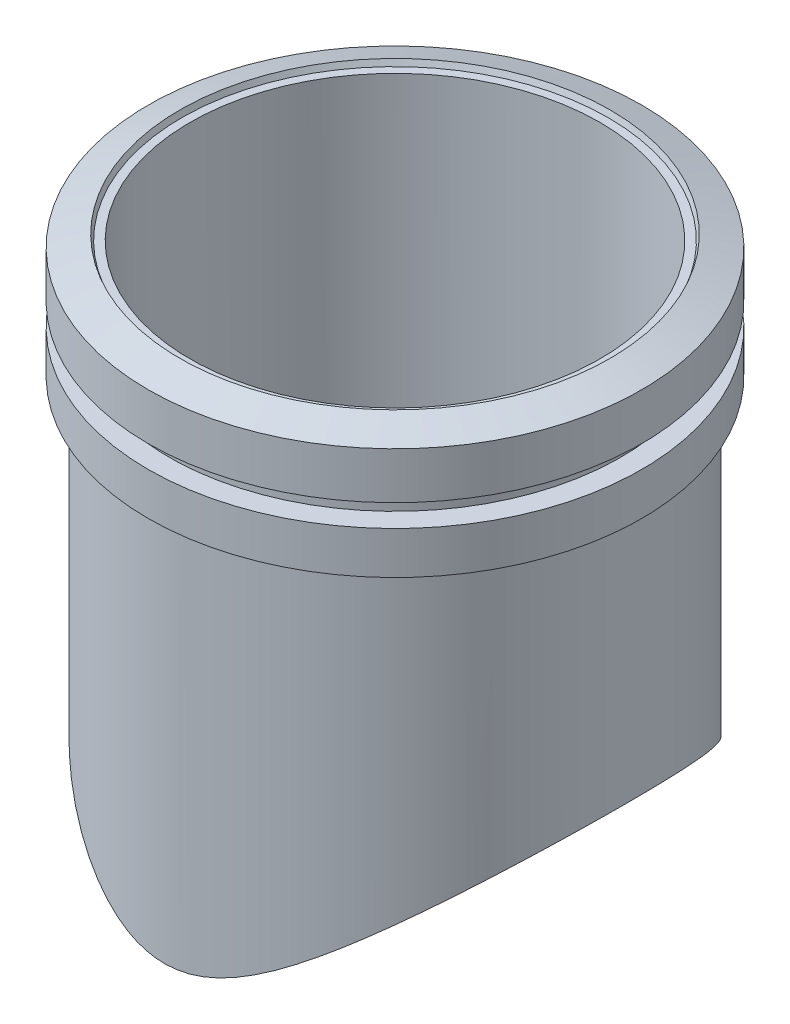
ISO-10303-21;
HEADER;
FILE_DESCRIPTION(('STEP AP214'),'2;1');
FILE_NAME('part.step','',(''),(''),'','','');
FILE_SCHEMA(('AUTOMOTIVE_DESIGN { 1 0 10303 214 1 1 1 1 }'));
ENDSEC;
DATA;
#1=APPLICATION_CONTEXT('core data for automotive mechanical design processes');
#2=APPLICATION_PROTOCOL_DEFINITION('international standard','automotive_design',2000,#1);
#3=PRODUCT_CONTEXT('',#1,'mechanical');
#4=PRODUCT('Part','Part','',(#3));
#5=PRODUCT_RELATED_PRODUCT_CATEGORY('part','',(#4));
#6=PRODUCT_DEFINITION_FORMATION('','',#4);
#7=PRODUCT_DEFINITION_CONTEXT('part definition',#1,'design');
#8=PRODUCT_DEFINITION('design','',#6,#7);
#9=PRODUCT_DEFINITION_SHAPE('','',#8);
#10=(LENGTH_UNIT() NAMED_UNIT(*) SI_UNIT(.MILLI.,.METRE.));
#11=(NAMED_UNIT(*) PLANE_ANGLE_UNIT() SI_UNIT($,.RADIAN.));
#12=(NAMED_UNIT(*) SI_UNIT($,.STERADIAN.) SOLID_ANGLE_UNIT());
#13=UNCERTAINTY_MEASURE_WITH_UNIT(LENGTH_MEASURE(1.E-05),#10,'distance_accuracy_value','');
#14=(GEOMETRIC_REPRESENTATION_CONTEXT(3) GLOBAL_UNCERTAINTY_ASSIGNED_CONTEXT((#13)) GLOBAL_UNIT_ASSIGNED_CONTEXT((#10,
#11,#12)) REPRESENTATION_CONTEXT('',''));
#15=CARTESIAN_POINT('',(0.,0.,0.));
#16=DIRECTION('',(0.,0.,1.));
#17=DIRECTION('',(1.,0.,0.));
#18=AXIS2_PLACEMENT_3D('',#15,#16,#17);
#19=CARTESIAN_POINT('',(0.,49.6,0.));
#20=DIRECTION('',(0.,-1.,0.));
#21=DIRECTION('',(0.,0.,-1.));
#22=AXIS2_PLACEMENT_3D('',#19,#20,#21);
#23=TOROIDAL_SURFACE('',#22,23.3,0.8);
#24=CARTESIAN_POINT('',(0.,49.6,0.));
#25=DIRECTION('',(0.,-1.,0.));
#26=DIRECTION('',(0.,0.,-1.));
#27=AXIS2_PLACEMENT_3D('',#24,#25,#26);
#28=CIRCLE('',#27,22.5);
#29=CARTESIAN_POINT('',(0.,49.6,-22.5));
#30=VERTEX_POINT('',#29);
#31=EDGE_CURVE('E281',#30,#30,#28,.T.);
#32=ORIENTED_EDGE('',*,*,#31,.F.);
#33=EDGE_LOOP('',(#32));
#34=FACE_BOUND('',#33,.T.);
#35=CARTESIAN_POINT('',(0.,50.4,0.));
#36=DIRECTION('',(0.,1.,0.));
#37=DIRECTION('',(0.,0.,-1.));
#38=AXIS2_PLACEMENT_3D('',#35,#36,#37);
#39=CIRCLE('',#38,23.3);
#40=CARTESIAN_POINT('',(0.,50.4,-23.3));
#41=VERTEX_POINT('',#40);
#42=EDGE_CURVE('E106',#41,#41,#39,.T.);
#43=ORIENTED_EDGE('',*,*,#42,.F.);
#44=EDGE_LOOP('',(#43));
#45=FACE_BOUND('',#44,.T.);
#46=ADVANCED_FACE('F16',(#34,#45),#23,.F.);
#47=CARTESIAN_POINT('',(50.,0.,0.));
#48=DIRECTION('',(-1.,0.,0.));
#49=DIRECTION('',(0.,0.,1.));
#50=AXIS2_PLACEMENT_3D('',#47,#48,#49);
#51=CYLINDRICAL_SURFACE('',#50,25.5);
#52=CARTESIAN_POINT('',(0.,15.8192920195564,-20.));
#53=CARTESIAN_POINT('',(0.385168296418414,15.8193005281235,-19.9999962674085));
#54=CARTESIAN_POINT('',(0.770478671122768,15.8334277549476,-19.9888442267379));
#55=CARTESIAN_POINT('',(1.53796910571031,15.8892601959286,-19.9444885805017));
#56=CARTESIAN_POINT('',(1.92014686797474,15.9309840874655,-19.911270040297));
#57=CARTESIAN_POINT('',(2.67939663154215,16.0401872882296,-19.823402485463));
#58=CARTESIAN_POINT('',(3.05645106766345,16.1077393443304,-19.7686929278103));
#59=CARTESIAN_POINT('',(3.80207187665018,16.2656963241814,-19.6389289621155));
#60=CARTESIAN_POINT('',(4.17063840294933,16.3561008344794,-19.5638749221491));
#61=CARTESIAN_POINT('',(5.01838044106002,16.5896827305573,-19.3665400751421));
#62=CARTESIAN_POINT('',(5.49375259261614,16.7404212992817,-19.2368508429216));
#63=CARTESIAN_POINT('',(6.42521927646011,17.0687770076708,-18.946104906881));
#64=CARTESIAN_POINT('',(6.8813054812548,17.2464056096065,-18.7850348180675));
#65=CARTESIAN_POINT('',(7.7745186002287,17.6218203088176,-18.433331904638));
#66=CARTESIAN_POINT('',(8.21160319370446,17.8196484133153,-18.242637024272));
#67=CARTESIAN_POINT('',(9.06578786663286,18.2290442383159,-17.8335567627009));
#68=CARTESIAN_POINT('',(9.48288829588846,18.4406117181719,-17.6151718664261));
#69=CARTESIAN_POINT('',(10.4314325119925,18.9434370017984,-17.0755137316319));
#70=CARTESIAN_POINT('',(10.9553363218371,19.2380083435394,-16.7440313786903));
#71=CARTESIAN_POINT('',(11.968409001003,19.8324165310754,-16.035564415496));
#72=CARTESIAN_POINT('',(12.4575663114036,20.1322550880938,-15.6585647748202));
#73=CARTESIAN_POINT('',(13.3997763799512,20.7285105780753,-14.8602462970423));
#74=CARTESIAN_POINT('',(13.8528562747375,21.0249299365845,-14.4389613345347));
#75=CARTESIAN_POINT('',(14.7212532376801,21.6069798772734,-13.5524706704013));
#76=CARTESIAN_POINT('',(15.1365821252066,21.892613819746,-13.0872788091049));
#77=CARTESIAN_POINT('',(15.8511596644705,22.3932438886249,-12.2064783981902));
#78=CARTESIAN_POINT('',(16.1574450701645,22.6113270410282,-11.7983186898014));
#79=CARTESIAN_POINT('',(16.7411748788905,23.0320645349061,-10.9542812814918));
#80=CARTESIAN_POINT('',(17.0186206450331,23.2347196054705,-10.5184048931758));
#81=CARTESIAN_POINT('',(17.541777748158,23.6206017252422,-9.62058374446001));
#82=CARTESIAN_POINT('',(17.7875278362058,23.8038524481182,-9.15867182775898));
#83=CARTESIAN_POINT('',(18.2447961974774,24.1474601018958,-8.21002486419841));
#84=CARTESIAN_POINT('',(18.4563199104165,24.3078206703301,-7.72329377813843));
#85=CARTESIAN_POINT('',(18.8119012319015,24.5789865080545,-6.80552802598846));
#86=CARTESIAN_POINT('',(18.9613366553437,24.69361955889,-6.37770274861088));
#87=CARTESIAN_POINT('',(19.2319173487559,24.9019916524194,-5.50822795085259));
#88=CARTESIAN_POINT('',(19.3530654636292,24.9957327962053,-5.06657982573031));
#89=CARTESIAN_POINT('',(19.5653905541487,25.1604853509046,-4.17213119539911));
#90=CARTESIAN_POINT('',(19.6565787529879,25.2315052730834,-3.71933493484386));
#91=CARTESIAN_POINT('',(19.8076781983531,25.3493960308825,-2.80541971788245));
#92=CARTESIAN_POINT('',(19.8675890653516,25.3962665734678,-2.3443006605555));
#93=CARTESIAN_POINT('',(19.9553031882005,25.4649440630707,-1.41565341946852));
#94=CARTESIAN_POINT('',(19.9830031884356,25.4866704064304,-0.948109459247581));
#95=CARTESIAN_POINT('',(20.0054787817369,25.5042963453268,-0.0117393419607368));
#96=CARTESIAN_POINT('',(20.0002543145534,25.5001958936021,0.457086817449946));
#97=CARTESIAN_POINT('',(19.9569697066212,25.4662612276469,1.39230458008247));
#98=CARTESIAN_POINT('',(19.9189074896035,25.4364253862162,1.85869602748609));
#99=CARTESIAN_POINT('',(19.8105827451003,25.3516873401837,2.78539760751576));
#100=CARTESIAN_POINT('',(19.7403208153587,25.2967856008963,3.24570785286789));
#101=CARTESIAN_POINT('',(19.5729419294475,25.1663952308072,4.13452834494142));
#102=CARTESIAN_POINT('',(19.4773144062655,25.0920509000137,4.56348966933961));
#103=CARTESIAN_POINT('',(19.2592432683588,24.9231557923461,5.4104313008813));
#104=CARTESIAN_POINT('',(19.1368007482676,24.8286058403034,5.82841205549036));
#105=CARTESIAN_POINT('',(18.8665539121948,24.6209135247743,6.65137298181702));
#106=CARTESIAN_POINT('',(18.7187465798072,24.5077689500666,7.05635160050156));
#107=CARTESIAN_POINT('',(18.3993460716096,24.2646905130305,7.85160593650099));
#108=CARTESIAN_POINT('',(18.2277514818531,24.1347556526961,8.24188077804841));
#109=CARTESIAN_POINT('',(17.8440252484605,23.8462085751735,9.04478253055461));
#110=CARTESIAN_POINT('',(17.629554165414,23.6860272481832,9.45572670826991));
#111=CARTESIAN_POINT('',(17.1757322602386,23.3502137067572,10.2570112252108));
#112=CARTESIAN_POINT('',(16.936380051314,23.1745806311736,10.6473504141489));
#113=CARTESIAN_POINT('',(16.4345143358644,22.8103798691017,11.406751423093));
#114=CARTESIAN_POINT('',(16.1719908038616,22.6218065917394,11.775803917721));
#115=CARTESIAN_POINT('',(15.6254345226118,22.2343664214845,12.4919471651126));
#116=CARTESIAN_POINT('',(15.3413989478464,22.0354981774799,12.8390350218835));
#117=CARTESIAN_POINT('',(14.6931298881427,21.5887038298004,13.5794316993007));
#118=CARTESIAN_POINT('',(14.3243554758663,21.3390451443036,13.9677278030836));
#119=CARTESIAN_POINT('',(13.5592598172992,20.8331732204723,14.711602701847));
#120=CARTESIAN_POINT('',(13.1629337954434,20.5769588507185,15.0671757999508));
#121=CARTESIAN_POINT('',(12.3434887058587,20.0626473064887,15.745523067542));
#122=CARTESIAN_POINT('',(11.920343768839,19.8045485333179,16.0682647619375));
#123=CARTESIAN_POINT('',(11.0481839517112,19.2921682815856,16.6799677760121));
#124=CARTESIAN_POINT('',(10.5991729572039,19.0378862368717,16.9689341497701));
#125=CARTESIAN_POINT('',(9.737609346108,18.5730422151571,17.4755214234953));
#126=CARTESIAN_POINT('',(9.32830785493652,18.3612093152009,17.6975083512477));
#127=CARTESIAN_POINT('',(8.49010804467082,17.9498901615141,18.1145574204379));
#128=CARTESIAN_POINT('',(8.06120840261142,17.7504047434419,18.3096177406215));
#129=CARTESIAN_POINT('',(7.18452685735578,17.3698521339386,18.6710198559506));
#130=CARTESIAN_POINT('',(6.73677955868262,17.1887531068403,18.8374116508407));
#131=CARTESIAN_POINT('',(5.82211028736721,16.8513073217511,19.1398747977017));
#132=CARTESIAN_POINT('',(5.35519575799503,16.6949510677221,19.2759577901093));
#133=CARTESIAN_POINT('',(4.53039975779174,16.4518483264456,19.4834549404584));
#134=CARTESIAN_POINT('',(4.17661065667498,16.3576544672562,19.56243907632));
#135=CARTESIAN_POINT('',(3.46064229115474,16.1896592864068,19.7016968171442));
#136=CARTESIAN_POINT('',(3.09846558967314,16.1158518222943,19.7619760585975));
#137=CARTESIAN_POINT('',(2.36797559378927,15.9914990288559,19.8627387191919));
#138=CARTESIAN_POINT('',(1.99967292788676,15.9409170393453,19.9032533420967));
#139=CARTESIAN_POINT('',(1.25876876154102,15.8650170349206,19.9638077203692));
#140=CARTESIAN_POINT('',(0.886167316834721,15.8396986928159,19.9838477409045));
#141=CARTESIAN_POINT('',(0.138047306713859,15.8154590786995,20.0030374412093));
#142=CARTESIAN_POINT('',(-0.237476962596149,15.8166448126126,20.0021024376531));
#143=CARTESIAN_POINT('',(-0.986830380246549,15.8456186668563,19.9791565661638));
#144=CARTESIAN_POINT('',(-1.36065953878624,15.8734066269102,19.9571458252108));
#145=CARTESIAN_POINT('',(-2.10420290950143,15.9543371110211,19.8925057226322));
#146=CARTESIAN_POINT('',(-2.47391136240842,16.0075114424119,19.849850493994));
#147=CARTESIAN_POINT('',(-3.20639228628432,16.1369414153828,19.744772253085));
#148=CARTESIAN_POINT('',(-3.56916370272964,16.213200536972,19.6823462603255));
#149=CARTESIAN_POINT('',(-4.39167675448599,16.4113989734668,19.5176103110091));
#150=CARTESIAN_POINT('',(-4.84850550613445,16.5401771804507,19.4089685529705));
#151=CARTESIAN_POINT('',(-5.74549228782827,16.8249661440016,19.1626169846874));
#152=CARTESIAN_POINT('',(-6.18564457674353,16.980986177158,19.0248972692469));
#153=CARTESIAN_POINT('',(-7.04942622431595,17.314306471562,18.7220615790558));
#154=CARTESIAN_POINT('',(-7.47301058164287,17.4916599891664,18.5568766311626));
#155=CARTESIAN_POINT('',(-8.30227329300515,17.8616931948393,18.2009853670481));
#156=CARTESIAN_POINT('',(-8.70795121036261,18.0543732563501,18.0102784288881));
#157=CARTESIAN_POINT('',(-9.65794865723456,18.5282415148698,17.5245584037203));
#158=CARTESIAN_POINT('',(-10.193938710616,18.8143985710852,17.218047806266));
#159=CARTESIAN_POINT('',(-11.2318666751824,19.3964001195072,16.5596795242306));
#160=CARTESIAN_POINT('',(-11.733791437518,19.6922482877882,16.2078044796913));
#161=CARTESIAN_POINT('',(-12.7029059677178,20.2846472894365,15.4599680974623));
#162=CARTESIAN_POINT('',(-13.1701063564753,20.5811978790852,15.0640203332916));
#163=CARTESIAN_POINT('',(-14.0684560402425,21.1673264229824,14.2286531302956));
#164=CARTESIAN_POINT('',(-14.4996155650559,21.45690633905,13.7892461047431));
#165=CARTESIAN_POINT('',(-15.2598287226721,21.9783595847533,12.9387284076166));
#166=CARTESIAN_POINT('',(-15.5943649197326,22.2122353076696,12.5337378480878));
#167=CARTESIAN_POINT('',(-16.2339145728,22.6658147330405,11.6935324180267));
#168=CARTESIAN_POINT('',(-16.538928580615,22.8855187003581,11.2583181126767));
#169=CARTESIAN_POINT('',(-17.1164229082229,23.3062845085997,10.3592052595511));
#170=CARTESIAN_POINT('',(-17.3889476405465,23.5073717124047,9.89534721624489));
#171=CARTESIAN_POINT('',(-17.8988980720266,23.8870589206684,8.93993735887239));
#172=CARTESIAN_POINT('',(-18.1363303609083,24.0656631460866,8.44839076821799));
#173=CARTESIAN_POINT('',(-18.5349765359363,24.3676324970736,7.52734997948828));
#174=CARTESIAN_POINT('',(-18.7022685967326,24.4952068904912,7.10185925033704));
#175=CARTESIAN_POINT('',(-19.0087099763371,24.7299686291591,6.23538540803275));
#176=CARTESIAN_POINT('',(-19.1478622900448,24.8371581438897,5.79440394942004));
#177=CARTESIAN_POINT('',(-19.3961565143195,25.0290767809252,4.89945478125518));
#178=CARTESIAN_POINT('',(-19.5053101136639,25.1138146508838,4.44549220603782));
#179=CARTESIAN_POINT('',(-19.6920727616679,25.2591426206073,3.52728495906508));
#180=CARTESIAN_POINT('',(-19.7696814266465,25.3197324266591,3.06304016231946));
#181=CARTESIAN_POINT('',(-19.8923541196746,25.415630621458,2.12569185465668));
#182=CARTESIAN_POINT('',(-19.9372824021787,25.4508335548193,1.65255967394507));
#183=CARTESIAN_POINT('',(-19.9932955683695,25.4947359980089,0.703059764330331));
#184=CARTESIAN_POINT('',(-20.0043803887942,25.5034354582955,0.226692029380803));
#185=CARTESIAN_POINT('',(-19.9925114292867,25.4941267884279,-0.725335082055802));
#186=CARTESIAN_POINT('',(-19.9695589360076,25.476119667816,-1.20099448463837));
#187=CARTESIAN_POINT('',(-19.8900199086886,25.413820651236,-2.14773278465842));
#188=CARTESIAN_POINT('',(-19.8334345107376,25.3695296431139,-2.61881183626973));
#189=CARTESIAN_POINT('',(-19.6923814711889,25.2594158163331,-3.52210202143449));
#190=CARTESIAN_POINT('',(-19.6099857048181,25.195195536837,-3.95483612700356));
#191=CARTESIAN_POINT('',(-19.4178166411699,25.0459166717671,-4.81047299720153));
#192=CARTESIAN_POINT('',(-19.3080447967134,24.9608591920067,-5.23337628224057));
#193=CARTESIAN_POINT('',(-19.0624913585213,24.771404428686,-6.06715269591557));
#194=CARTESIAN_POINT('',(-18.9267064314526,24.6670046666497,-6.4780242750139));
#195=CARTESIAN_POINT('',(-18.6306619336807,24.4405906574408,-7.28584442131404));
#196=CARTESIAN_POINT('',(-18.4704009397121,24.3185753859618,-7.68279217720411));
#197=CARTESIAN_POINT('',(-18.1127912908317,24.0480439525098,-8.49346454478043));
#198=CARTESIAN_POINT('',(-17.9134725549347,23.8981712605409,-8.90586635809929));
#199=CARTESIAN_POINT('',(-17.4899561386799,23.5823801606839,-9.71125578095484));
#200=CARTESIAN_POINT('',(-17.2657573565956,23.4164610422774,-10.1042425296482));
#201=CARTESIAN_POINT('',(-16.794232970741,23.070988243249,-10.8699573108004));
#202=CARTESIAN_POINT('',(-16.5469006403656,22.8914305997856,-11.2426794007198));
#203=CARTESIAN_POINT('',(-16.0307597278642,22.5211662767132,-11.9671470730751));
#204=CARTESIAN_POINT('',(-15.7619482772085,22.3304581088704,-12.3188898427379));
#205=CARTESIAN_POINT('',(-15.1493537177824,21.9019624528567,-13.0680936333836));
#206=CARTESIAN_POINT('',(-14.8012258417966,21.6622945870107,-13.4609333671019));
#207=CARTESIAN_POINT('',(-14.0780475780001,21.1747505170486,-14.215547022719));
#208=CARTESIAN_POINT('',(-13.7029931248682,20.9268730765233,-14.5773162354671));
#209=CARTESIAN_POINT('',(-12.9268273837771,20.4270546703145,-15.2698387394059));
#210=CARTESIAN_POINT('',(-12.5256856139809,20.1751092193213,-15.6005546026116));
#211=CARTESIAN_POINT('',(-11.6985285942981,19.6722564907814,-16.2300508894596));
#212=CARTESIAN_POINT('',(-11.2725156324021,19.421349120005,-16.5288342435525));
#213=CARTESIAN_POINT('',(-10.4205762078996,18.9399571066887,-17.0778709773672));
#214=CARTESIAN_POINT('',(-9.99600261935953,18.709119179912,-17.3299118390753));
#215=CARTESIAN_POINT('',(-9.12472822463672,18.258465919076,-17.8040838349328));
#216=CARTESIAN_POINT('',(-8.67802443072749,18.0386520814484,-18.0262109153857));
#217=CARTESIAN_POINT('',(-7.76284014513636,17.6166704887752,-18.4388130489038));
#218=CARTESIAN_POINT('',(-7.29438950697765,17.4144795787326,-18.6293299419448));
#219=CARTESIAN_POINT('',(-6.57539029585324,17.1300151933857,-18.8899225093034));
#220=CARTESIAN_POINT('',(-6.33304758525342,17.0383452554637,-18.9725771957089));
#221=CARTESIAN_POINT('',(-5.84288133517667,16.8622925713517,-19.1292174461741));
#222=CARTESIAN_POINT('',(-5.59505640969113,16.7779116950457,-19.2032007874754));
#223=CARTESIAN_POINT('',(-4.98851070223597,16.5837715029092,-19.3714035924314));
#224=CARTESIAN_POINT('',(-4.62709689064272,16.4783160109181,-19.4609997505321));
#225=CARTESIAN_POINT('',(-3.89477429288497,16.2878599704064,-19.6206802488918));
#226=CARTESIAN_POINT('',(-3.52386879053478,16.2028524506381,-19.6907712402538));
#227=CARTESIAN_POINT('',(-2.77523392750355,16.0566995233523,-19.8101313613531));
#228=CARTESIAN_POINT('',(-2.39752864104316,15.9954826129107,-19.8594629213814));
#229=CARTESIAN_POINT('',(-1.63675905315612,15.89927364653,-19.9365736030367));
#230=CARTESIAN_POINT('',(-1.2536986706217,15.864263340869,-19.9643677233541));
#231=CARTESIAN_POINT('',(-0.72483401011464,15.8352272880365,-19.9873870175213));
#232=CARTESIAN_POINT('',(-0.579988150790733,15.8292576929818,-19.9921141456726));
#233=CARTESIAN_POINT('',(-0.290101592918974,15.8212882132276,-19.9984215326428));
#234=CARTESIAN_POINT('',(-0.145060872669706,15.8192888150866,-20.0000014057569));
#235=CARTESIAN_POINT('',(0.,15.8192920195564,-20.));
#236=B_SPLINE_CURVE_WITH_KNOTS('',3,(#52,#53,#54,#55,#56,#57,#58,#59,#60,#61,#62,#63,#64,#65,
#66,#67,#68,#69,#70,#71,#72,#73,#74,#75,#76,#77,#78,#79,#80,#81,#82,#83,#84,#85,#86,#87,#88,#89,
#90,#91,#92,#93,#94,#95,#96,#97,#98,#99,#100,#101,#102,#103,#104,#105,#106,#107,#108,#109,#110,
#111,#112,#113,#114,#115,#116,#117,#118,#119,#120,#121,#122,#123,#124,#125,#126,#127,#128,#129,
#130,#131,#132,#133,#134,#135,#136,#137,#138,#139,#140,#141,#142,#143,#144,#145,#146,#147,#148,
#149,#150,#151,#152,#153,#154,#155,#156,#157,#158,#159,#160,#161,#162,#163,#164,#165,#166,#167,
#168,#169,#170,#171,#172,#173,#174,#175,#176,#177,#178,#179,#180,#181,#182,#183,#184,#185,#186,
#187,#188,#189,#190,#191,#192,#193,#194,#195,#196,#197,#198,#199,#200,#201,#202,#203,#204,#205,
#206,#207,#208,#209,#210,#211,#212,#213,#214,#215,#216,#217,#218,#219,#220,#221,#222,#223,#224,
#225,#226,#227,#228,#229,#230,#231,#232,#233,#234,#235),.UNSPECIFIED.,.T.,.F.,(4,2,2,2,2,2,2,2,
2,2,2,2,2,2,2,2,2,2,2,2,2,2,2,2,2,2,2,2,2,2,2,2,2,2,2,2,2,2,2,2,2,2,2,2,2,2,2,2,2,2,2,2,2,2,2,2,
2,2,2,2,2,2,2,2,2,2,2,2,2,2,2,2,2,2,2,2,2,2,2,2,2,2,2,2,2,2,2,2,2,2,2,4),(0.,1.15534021961438,
2.3114631729287,3.47086670721213,4.63024926678437,6.17368640214376,7.71778331247461,
9.26515941127682,10.8125084148937,12.8690470758518,14.9262667005965,16.9819240184363,
19.0369355025628,20.7002656098664,22.3635170637951,24.0247153550062,25.685649366383,
27.0865657856083,28.4873412515103,29.8875913772883,31.2878584936809,32.6926020591155,
34.097348195144,35.5021831571331,36.9069920413268,38.2427639263706,39.5784812931127,
40.9143576147744,42.2503133768019,43.7202283746979,45.1902253449999,46.6608614824915,
48.131691118101,49.9025296785354,51.673675950304,53.4465574509925,55.2191733202926,
56.7526998593312,58.286330071828,59.8172578475404,61.3475966354138,62.4702275677717,
63.5925198797917,64.7130345709333,65.8335347500447,66.9585595817071,68.0835776352105,
69.210008971141,70.3366102001062,71.7950665035712,73.2540204234864,74.7166951242714,
76.1794054750929,78.2182495710889,80.2578762159451,82.296876425495,84.3352959079963,
86.0587199755461,87.7821118238369,89.5031201213014,91.2238048328708,92.6463809416032,
94.068805566482,95.4906751657991,96.9125620587987,98.3403218773163,99.7680843646776,
101.1957928822,102.623453175764,103.957487555487,105.291451154412,106.625585802751,
107.959798059598,109.404224105889,110.848714139121,112.293625504226,113.738730160349,
115.468162162462,117.197855822127,118.929608182806,120.661201483625,122.295038300645,
123.929096300948,125.560973865017,126.37662462713,127.192484012906,128.352398169595,
129.511916318997,130.667922063618,131.823122039597,132.258189324828,132.693309925475),.UNSPECIFIED.);
#237=CARTESIAN_POINT('',(0.,15.8192920195563,-20.));
#238=VERTEX_POINT('',#237);
#239=EDGE_CURVE('E115',#238,#238,#236,.T.);
#240=ORIENTED_EDGE('',*,*,#239,.F.);
#241=EDGE_LOOP('',(#240));
#242=FACE_BOUND('',#241,.T.);
#243=CARTESIAN_POINT('',(0.,12.,-22.5));
#244=CARTESIAN_POINT('',(0.355011696159677,11.9999971490058,-22.5000009085985));
#245=CARTESIAN_POINT('',(0.710011821924663,12.0158382976497,-22.4915741849523));
#246=CARTESIAN_POINT('',(1.41663806621268,12.078199132187,-22.4581461735071));
#247=CARTESIAN_POINT('',(1.76826254768341,12.1247330087927,-22.4331372189235));
#248=CARTESIAN_POINT('',(2.46594469600496,12.2459155182611,-22.3672142322374));
#249=CARTESIAN_POINT('',(2.811986079735,12.3206347875738,-22.3262602313103));
#250=CARTESIAN_POINT('',(3.49584974605379,12.4944572491321,-22.2294487998164));
#251=CARTESIAN_POINT('',(3.83366813948306,12.5935717422645,-22.1735844611431));
#252=CARTESIAN_POINT('',(4.40900884389314,12.7822905472875,-22.0651633142943));
#253=CARTESIAN_POINT('',(4.64874886500101,12.8671117354946,-22.0158624905146));
#254=CARTESIAN_POINT('',(5.12309914112535,13.0459933165562,-21.9103368278869));
#255=CARTESIAN_POINT('',(5.35771092837757,13.1400509022806,-21.8541140914397));
#256=CARTESIAN_POINT('',(6.05426436902027,13.4341572969414,-21.6754672171669));
#257=CARTESIAN_POINT('',(6.50869513635015,13.6460619959034,-21.5431081969924));
#258=CARTESIAN_POINT('',(7.39966330473619,14.0927633768765,-21.2535922397898));
#259=CARTESIAN_POINT('',(7.83613845140935,14.3276314974616,-21.0963569109112));
#260=CARTESIAN_POINT('',(8.69118083199279,14.8125861187026,-20.7587230355586));
#261=CARTESIAN_POINT('',(9.10974983754477,15.0626711078362,-20.5783267877357));
#262=CARTESIAN_POINT('',(9.8528668018995,15.5245334561346,-20.2313104338243));
#263=CARTESIAN_POINT('',(10.1802578921727,15.7346394587969,-20.0685094764168));
#264=CARTESIAN_POINT('',(10.8246696577615,16.1590430094003,-19.7283876215786));
#265=CARTESIAN_POINT('',(11.1416892457365,16.3733409930862,-19.5510652085131));
#266=CARTESIAN_POINT('',(11.7658130159941,16.8042668150198,-19.1819483606786));
#267=CARTESIAN_POINT('',(12.0729127135922,17.0208956496199,-18.9901475075679));
#268=CARTESIAN_POINT('',(12.6772332139873,17.4547439159543,-18.5921658400609));
#269=CARTESIAN_POINT('',(12.9744530828772,17.6719634014334,-18.3859836719223));
#270=CARTESIAN_POINT('',(13.8506479377524,18.3217466688745,-17.7463368548872));
#271=CARTESIAN_POINT('',(14.4150203035647,18.7530392795046,-17.291261818317));
#272=CARTESIAN_POINT('',(15.5027130457871,19.6015011077985,-16.3231581760896));
#273=CARTESIAN_POINT('',(16.0260522920062,20.0186767666254,-15.8101564770433));
#274=CARTESIAN_POINT('',(16.910792885763,20.7346161992172,-14.8524301948259));
#275=CARTESIAN_POINT('',(17.2814205547797,21.0382351318119,-14.4198418300444));
#276=CARTESIAN_POINT('',(17.9940635043083,21.6274393103612,-13.5200977618041));
#277=CARTESIAN_POINT('',(18.3360794736858,21.9130249904504,-13.0529428910916));
#278=CARTESIAN_POINT('',(18.9879734948965,22.4613474543538,-12.0849780877073));
#279=CARTESIAN_POINT('',(19.2978950535489,22.7241150898682,-11.5842152734265));
#280=CARTESIAN_POINT('',(19.7361512668506,23.0978326334566,-10.8084486457364));
#281=CARTESIAN_POINT('',(19.8777934398973,23.2189947034461,-10.545767915073));
#282=CARTESIAN_POINT('',(20.1517759818287,23.4539785046807,-10.0122857845848));
#283=CARTESIAN_POINT('',(20.2841139404414,23.5677983332808,-9.741482306279));
#284=CARTESIAN_POINT('',(20.6179330273733,23.855569654448,-9.02171946553313));
#285=CARTESIAN_POINT('',(20.8114157144503,24.0230534264585,-8.56639449353838));
#286=CARTESIAN_POINT('',(21.170113300908,24.3344566259233,-7.63703790654663));
#287=CARTESIAN_POINT('',(21.3353340668733,24.4783809435606,-7.16301019904996));
#288=CARTESIAN_POINT('',(21.6352324352585,24.7402088923225,-6.19851720847537));
#289=CARTESIAN_POINT('',(21.769920536304,24.8581214671823,-5.70805764225919));
#290=CARTESIAN_POINT('',(22.0066995844003,25.0657452619938,-4.71343605143218));
#291=CARTESIAN_POINT('',(22.1087901736007,25.155456172352,-4.20927387646218));
#292=CARTESIAN_POINT('',(22.2790611771452,25.3052349391832,-3.18793236975981));
#293=CARTESIAN_POINT('',(22.3470498747505,25.3651351893469,-2.67069624383672));
#294=CARTESIAN_POINT('',(22.4469630453153,25.453203955917,-1.63004863549525));
#295=CARTESIAN_POINT('',(22.478887435004,25.4813723990562,-1.10663713882103));
#296=CARTESIAN_POINT('',(22.5060334577995,25.5053230002041,-0.0582200587604765));
#297=CARTESIAN_POINT('',(22.5012620728037,25.5011113189959,0.466785202388685));
#298=CARTESIAN_POINT('',(22.4551266143717,25.4604122433213,1.51390059076578));
#299=CARTESIAN_POINT('',(22.4137646339362,25.4239266949367,2.0360108818686));
#300=CARTESIAN_POINT('',(22.3005397377214,25.3241669366339,3.02690413781898));
#301=CARTESIAN_POINT('',(22.2317082478141,25.2635564387321,3.49630884288567));
#302=CARTESIAN_POINT('',(22.0654327734358,25.117359617416,4.42602019256924));
#303=CARTESIAN_POINT('',(21.9679908551637,25.031775097588,4.88632749162484));
#304=CARTESIAN_POINT('',(21.7458855962204,24.8370828642701,5.79529249861988));
#305=CARTESIAN_POINT('',(21.6212179146779,24.7279713996831,6.24394833607394));
#306=CARTESIAN_POINT('',(21.3463044527148,24.4879607604684,7.12736504790895));
#307=CARTESIAN_POINT('',(21.1960570965593,24.3570602436233,7.56212506433189));
#308=CARTESIAN_POINT('',(20.861262309195,24.0662614938775,8.44358501040547));
#309=CARTESIAN_POINT('',(20.6751262558396,23.9050364043153,8.88924240002556));
#310=CARTESIAN_POINT('',(20.2780051926487,23.5624153435613,9.76125423048376));
#311=CARTESIAN_POINT('',(20.0670198247298,23.381019081701,10.187608393036));
#312=CARTESIAN_POINT('',(19.6222811465769,23.000449325332,11.0199230146931));
#313=CARTESIAN_POINT('',(19.3885298884836,22.8012774332718,11.425885306951));
#314=CARTESIAN_POINT('',(18.9001272128824,22.3874519429069,12.2168458678504));
#315=CARTESIAN_POINT('',(18.6454714455285,22.1727951236043,12.6018397454834));
#316=CARTESIAN_POINT('',(17.9796776774908,21.615283246172,13.5449592103915));
#317=CARTESIAN_POINT('',(17.5559613201585,21.2637499628249,14.0891504993974));
#318=CARTESIAN_POINT('',(16.6691573029974,20.5376704041992,15.1279892572952));
#319=CARTESIAN_POINT('',(16.206051613248,20.1631136122185,15.6226138096075));
#320=CARTESIAN_POINT('',(15.2419058790551,19.3966390035867,16.5647436390469));
#321=CARTESIAN_POINT('',(14.7406990715207,19.0046483994663,17.0120185290901));
#322=CARTESIAN_POINT('',(13.7045686350383,18.2127300003676,17.8572622933985));
#323=CARTESIAN_POINT('',(13.169653320247,17.8128041791434,18.2552432546831));
#324=CARTESIAN_POINT('',(12.0534193314959,17.0039056039515,19.0113216857351));
#325=CARTESIAN_POINT('',(11.4713047633249,16.5949414840999,19.3682598399334));
#326=CARTESIAN_POINT('',(10.5707091971357,15.990333370764,19.8652367712509));
#327=CARTESIAN_POINT('',(10.265761951089,15.7901609496345,20.0245689809818));
#328=CARTESIAN_POINT('',(9.64636536804302,15.3946560998933,20.3301975976966));
#329=CARTESIAN_POINT('',(9.33191730317564,15.1993230296252,20.4764957396366));
#330=CARTESIAN_POINT('',(8.69487122534817,14.8167576987215,20.7549837334137));
#331=CARTESIAN_POINT('',(8.37233167445228,14.6294847215007,20.8872511368626));
#332=CARTESIAN_POINT('',(7.71669413442923,14.2644030661692,21.1382559811822));
#333=CARTESIAN_POINT('',(7.38359474605337,14.0865956507424,21.2569916193451));
#334=CARTESIAN_POINT('',(6.70682924079189,13.7439639537202,21.4801111396954));
#335=CARTESIAN_POINT('',(6.36318222041383,13.5791179344662,21.5845192797804));
#336=CARTESIAN_POINT('',(5.6643811077396,13.2660358103495,21.7783417932985));
#337=CARTESIAN_POINT('',(5.30923218181597,13.1177923778344,21.8677627901193));
#338=CARTESIAN_POINT('',(4.64065644473216,12.8629277562585,22.0184848373203));
#339=CARTESIAN_POINT('',(4.32884341602977,12.7533939396914,22.0819892067979));
#340=CARTESIAN_POINT('',(3.69698660926364,12.5530073783086,22.1965163283083));
#341=CARTESIAN_POINT('',(3.37694366549199,12.4621527482594,22.2475403400443));
#342=CARTESIAN_POINT('',(2.73045797414158,12.3027488969819,22.3360849765483));
#343=CARTESIAN_POINT('',(2.40403677039549,12.2341349828514,22.3736447997856));
#344=CARTESIAN_POINT('',(1.74556350749751,12.1219562979519,22.4346224902852));
#345=CARTESIAN_POINT('',(1.41351170799163,12.0783903753507,22.4580410078381));
#346=CARTESIAN_POINT('',(0.743160486774006,12.0183153549243,22.4902489886797));
#347=CARTESIAN_POINT('',(0.404831706425667,12.0020564275316,22.4989032014418));
#348=CARTESIAN_POINT('',(-0.272019299640959,11.9983110516426,22.5009008077375));
#349=CARTESIAN_POINT('',(-0.610541518138528,12.0108235914033,22.4942447396541));
#350=CARTESIAN_POINT('',(-1.28526071955883,12.0639363384059,22.4658034614574));
#351=CARTESIAN_POINT('',(-1.62145295934727,12.1045827329,22.4439933728145));
#352=CARTESIAN_POINT('',(-2.28837688336771,12.21180617308,22.3858318625584));
#353=CARTESIAN_POINT('',(-2.61910754407163,12.2783880229862,22.3494777468114));
#354=CARTESIAN_POINT('',(-3.36323519198175,12.4558149670881,22.2511925738404));
#355=CARTESIAN_POINT('',(-3.77435891725427,12.5737968153787,22.1849774193651));
#356=CARTESIAN_POINT('',(-4.58286556445355,12.8396484606593,22.0321776127399));
#357=CARTESIAN_POINT('',(-4.98024299395643,12.987530046381,21.9455849240149));
#358=CARTESIAN_POINT('',(-5.76201580095545,13.3068823388776,21.7534296822576));
#359=CARTESIAN_POINT('',(-6.14636813781919,13.4784232466457,21.6478103775492));
#360=CARTESIAN_POINT('',(-6.90131216796498,13.8390063792507,21.4190915151855));
#361=CARTESIAN_POINT('',(-7.27190389722095,14.0280485583302,21.2959920032321));
#362=CARTESIAN_POINT('',(-7.96024882604525,14.3975970510641,21.0476418338829));
#363=CARTESIAN_POINT('',(-8.27934410134137,14.5767710821888,20.9241029837315));
#364=CARTESIAN_POINT('',(-8.90790465497059,14.9427397508316,20.6643386821493));
#365=CARTESIAN_POINT('',(-9.2173684221086,15.129535573698,20.52811125312));
#366=CARTESIAN_POINT('',(-9.82728585377352,15.5086572005088,20.2432162153684));
#367=CARTESIAN_POINT('',(-10.127734787595,15.7009858076706,20.0945422249768));
#368=CARTESIAN_POINT('',(-10.719869677735,16.0893053512478,19.7849937308505));
#369=CARTESIAN_POINT('',(-11.0115546580862,16.2852966916379,19.6241178752763));
#370=CARTESIAN_POINT('',(-11.8746774771291,16.8769540447054,19.1229048275536));
#371=CARTESIAN_POINT('',(-12.4334586460899,17.2758444043422,18.7643218512771));
#372=CARTESIAN_POINT('',(-13.517760033128,18.0719384210224,17.9988968486942));
#373=CARTESIAN_POINT('',(-14.0432889447537,18.4691424933864,17.5920675166435));
#374=CARTESIAN_POINT('',(-15.0870342463891,19.2744059339108,16.7069917866196));
#375=CARTESIAN_POINT('',(-15.6034392251961,19.6819507556007,16.2261270270282));
#376=CARTESIAN_POINT('',(-16.5959497795904,20.4777386411011,15.2095111525646));
#377=CARTESIAN_POINT('',(-17.0720458999749,20.8659771674915,14.6737472248409));
#378=CARTESIAN_POINT('',(-17.9779283615501,21.6134377853105,13.5485721555379));
#379=CARTESIAN_POINT('',(-18.4078467972871,21.9727418655175,12.9593234446897));
#380=CARTESIAN_POINT('',(-19.0141091395775,22.4838749622333,12.0353359736196));
#381=CARTESIAN_POINT('',(-19.2097274136307,22.6495868304046,11.7207175958226));
#382=CARTESIAN_POINT('',(-19.5873231012268,22.9707061174028,11.0781611342412));
#383=CARTESIAN_POINT('',(-19.7692975190334,23.1261112723592,10.7502201494852));
#384=CARTESIAN_POINT('',(-20.172655777943,23.4717304461937,9.97787650183338));
#385=CARTESIAN_POINT('',(-20.3887937401546,23.6578216851571,9.52885635053152));
#386=CARTESIAN_POINT('',(-20.7934283971978,24.0074216286866,8.61017834987115));
#387=CARTESIAN_POINT('',(-20.9819330220145,24.1709368111551,8.14052647171382));
#388=CARTESIAN_POINT('',(-21.3288589162183,24.4726970415614,7.18255695497596));
#389=CARTESIAN_POINT('',(-21.4872935646003,24.6109533268781,6.69424773430886));
#390=CARTESIAN_POINT('',(-21.7718046362256,24.8597407975091,5.70133304474871));
#391=CARTESIAN_POINT('',(-21.8978800847131,24.970271147633,5.19672708546447));
#392=CARTESIAN_POINT('',(-22.1162577944802,25.1619972339507,4.1710729991276));
#393=CARTESIAN_POINT('',(-22.2083274331038,25.2429908732166,3.64993717513088));
#394=CARTESIAN_POINT('',(-22.3557496641865,25.3727869784903,2.59850522817324));
#395=CARTESIAN_POINT('',(-22.4111023601237,25.4215895352209,2.06820913103273));
#396=CARTESIAN_POINT('',(-22.4839603389695,25.4858426804665,1.00316603122109));
#397=CARTESIAN_POINT('',(-22.5014773387993,25.5013035941862,0.468420457970316));
#398=CARTESIAN_POINT('',(-22.498327810171,25.4985244785218,-0.600846146466345));
#399=CARTESIAN_POINT('',(-22.477664206383,25.4802870304637,-1.13536719171418));
#400=CARTESIAN_POINT('',(-22.4025753246364,25.4140731104218,-2.14593474026907));
#401=CARTESIAN_POINT('',(-22.3517475171405,25.3692658375501,-2.62246466655105));
#402=CARTESIAN_POINT('',(-22.2203972479848,25.2536152436719,-3.56816624162617));
#403=CARTESIAN_POINT('',(-22.1398771730483,25.1827740153278,-4.03733847868569));
#404=CARTESIAN_POINT('',(-21.9503706684287,25.0163291115987,-4.96544138705057));
#405=CARTESIAN_POINT('',(-21.8413814159914,24.9207229807507,-5.42437103789033));
#406=CARTESIAN_POINT('',(-21.5964793960237,24.7063638965206,-6.32944740890716));
#407=CARTESIAN_POINT('',(-21.460565146043,24.5876096686444,-6.77559342368737));
#408=CARTESIAN_POINT('',(-21.1579449496045,24.3239165299423,-7.66957541633761));
#409=CARTESIAN_POINT('',(-20.9902716169171,24.1781594816182,-8.1168414494114));
#410=CARTESIAN_POINT('',(-20.6298264612877,23.8659094971773,-8.99360670254011));
#411=CARTESIAN_POINT('',(-20.4370547384201,23.69941664374,-9.42310599342691));
#412=CARTESIAN_POINT('',(-20.0283847328762,23.3479190045551,-10.2631381480988));
#413=CARTESIAN_POINT('',(-19.8124836293615,23.1629119610151,-10.6736686897135));
#414=CARTESIAN_POINT('',(-19.3594485725855,22.776616469735,-11.4749142807271));
#415=CARTESIAN_POINT('',(-19.1223101905278,22.5753246268323,-11.8656251702249));
#416=CARTESIAN_POINT('',(-18.5050020470942,22.0543757406232,-12.8170983459681));
#417=CARTESIAN_POINT('',(-18.1126206690868,21.7258762210044,-13.3651629449537));
#418=CARTESIAN_POINT('',(-17.2889734457131,21.0441233793542,-14.4148142765184));
#419=CARTESIAN_POINT('',(-16.857690809244,20.6908593829346,-14.916380747688));
#420=CARTESIAN_POINT('',(-15.9587713918157,19.9652618058331,-15.8745239639267));
#421=CARTESIAN_POINT('',(-15.4910245281919,19.5928717380863,-16.3309542342524));
#422=CARTESIAN_POINT('',(-14.5230904672645,18.8368966588189,-17.1974352443299));
#423=CARTESIAN_POINT('',(-14.0229092379563,18.4533137139167,-17.6074944785688));
#424=CARTESIAN_POINT('',(-12.9799231974944,17.6735861711073,-18.3903839009178));
#425=CARTESIAN_POINT('',(-12.436421792483,17.2773510736088,-18.7621939962672));
#426=CARTESIAN_POINT('',(-11.3161554769462,16.4892733709106,-19.4584165875142));
#427=CARTESIAN_POINT('',(-10.7393744860475,16.0974330002815,-19.7828058980848));
#428=CARTESIAN_POINT('',(-9.84885385115182,15.5225369874726,-20.2326490443784));
#429=CARTESIAN_POINT('',(-9.5481901101443,15.3332833244768,-20.3763126594575));
#430=CARTESIAN_POINT('',(-8.93764519891971,14.9607112463527,-20.6514083707949));
#431=CARTESIAN_POINT('',(-8.62776331473917,14.7773932932653,-20.782839516352));
#432=CARTESIAN_POINT('',(-7.99861861941213,14.4191232134284,-21.0329879166036));
#433=CARTESIAN_POINT('',(-7.67936542703468,14.2441629618149,-21.15171766404));
#434=CARTESIAN_POINT('',(-7.03067996985699,13.9051786929146,-21.3760916427462));
#435=CARTESIAN_POINT('',(-6.7012502799079,13.7411519418753,-21.4817391507367));
#436=CARTESIAN_POINT('',(-6.04015267109439,13.4313211023357,-21.6767678988234));
#437=CARTESIAN_POINT('',(-5.70875621132275,13.2851589050018,-21.7664953300516));
#438=CARTESIAN_POINT('',(-5.03541650598041,13.0100354731329,-21.9320487260153));
#439=CARTESIAN_POINT('',(-4.69347284313266,12.881074920221,-22.0078741399216));
#440=CARTESIAN_POINT('',(-4.00043294812125,12.6450684644312,-22.1443172431996));
#441=CARTESIAN_POINT('',(-3.64937306652524,12.5379472076277,-22.2049873930924));
#442=CARTESIAN_POINT('',(-2.93810146231144,12.3496967257264,-22.3102367381894));
#443=CARTESIAN_POINT('',(-2.57789519233631,12.2685523896411,-22.3548252901094));
#444=CARTESIAN_POINT('',(-1.8501268996873,12.1365163397064,-22.4267850017745));
#445=CARTESIAN_POINT('',(-1.48256378005061,12.0856291726969,-22.4541535738551));
#446=CARTESIAN_POINT('',(-0.743329838580214,12.0173706909491,-22.4907615732983));
#447=CARTESIAN_POINT('',(-0.371658578824092,12.0000029846804,-22.4999990487964));
#448=CARTESIAN_POINT('',(0.,12.,-22.5));
#449=B_SPLINE_CURVE_WITH_KNOTS('',3,(#243,#244,#245,#246,#247,#248,#249,#250,#251,#252,#253,
#254,#255,#256,#257,#258,#259,#260,#261,#262,#263,#264,#265,#266,#267,#268,#269,#270,#271,#272,
#273,#274,#275,#276,#277,#278,#279,#280,#281,#282,#283,#284,#285,#286,#287,#288,#289,#290,#291,
#292,#293,#294,#295,#296,#297,#298,#299,#300,#301,#302,#303,#304,#305,#306,#307,#308,#309,#310,
#311,#312,#313,#314,#315,#316,#317,#318,#319,#320,#321,#322,#323,#324,#325,#326,#327,#328,#329,
#330,#331,#332,#333,#334,#335,#336,#337,#338,#339,#340,#341,#342,#343,#344,#345,#346,#347,#348,
#349,#350,#351,#352,#353,#354,#355,#356,#357,#358,#359,#360,#361,#362,#363,#364,#365,#366,#367,
#368,#369,#370,#371,#372,#373,#374,#375,#376,#377,#378,#379,#380,#381,#382,#383,#384,#385,#386,
#387,#388,#389,#390,#391,#392,#393,#394,#395,#396,#397,#398,#399,#400,#401,#402,#403,#404,#405,
#406,#407,#408,#409,#410,#411,#412,#413,#414,#415,#416,#417,#418,#419,#420,#421,#422,#423,#424,
#425,#426,#427,#428,#429,#430,#431,#432,#433,#434,#435,#436,#437,#438,#439,#440,#441,#442,#443,
#444,#445,#446,#447,#448),.UNSPECIFIED.,.T.,.F.,(4,2,2,2,2,2,2,2,2,2,2,2,2,2,2,2,2,2,2,2,2,2,2,
2,2,2,2,2,2,2,2,2,2,2,2,2,2,2,2,2,2,2,2,2,2,2,2,2,2,2,2,2,2,2,2,2,2,2,2,2,2,2,2,2,2,2,2,2,2,2,2,
2,2,2,2,2,2,2,2,2,2,2,2,2,2,2,2,2,2,2,2,2,2,2,2,2,2,2,2,2,2,2,4),(0.,1.06457881883738,
2.1296501885943,3.19740870028642,4.2656627763566,5.04246319192905,5.81902824836485,
7.37289274676765,8.93175516730297,10.490462994875,11.7551800963744,13.020029367712,
14.2854426816196,15.550975272621,18.0785419447906,20.6049393687557,22.5398196268774,
24.4746532867001,26.4068287948973,27.3728330894655,28.3390867139556,29.9043819192905,
31.4693518066957,33.0337827618216,34.5982308904354,36.1713782514384,37.7445292447606,
39.3173809309559,40.8901426550464,42.3233767363491,43.7565073372472,45.189866603297,
46.6233141977574,48.1493474456799,49.6754026867332,51.2013204946991,52.7275566270315,
55.0464973385421,57.3665052850732,59.6973276166767,62.0275772874313,64.4126780282819,
65.6065635912564,66.8002899987495,67.9870307183267,69.1739293516834,70.3587929761276,
71.543131575647,72.5520112492781,73.5607890497105,74.5666056624473,75.5723760190004,
76.5873113678111,77.6022110271687,78.6187808079628,79.6355389852751,80.9318543771433,
82.2286818745082,83.5294435391987,84.8302018031102,85.9885152902704,87.1470096112481,
88.3061016030218,89.4653221982123,91.7865234236229,94.1071152596157,96.5487566963778,
98.9909692884971,101.425998465042,102.643053608087,103.86037519806,105.454652567155,
107.048471524385,108.641579674856,110.234735808883,111.838596760551,113.442453192095,
115.045812871704,116.649049737552,118.091342515655,119.533519384673,120.975839301633,
122.418238652667,123.914996299071,125.411747977675,126.908682407028,128.405929735436,
130.652110454852,132.899265384481,135.153488598794,137.407298201576,139.710796990606,
142.015418283572,143.164787810479,144.314246591312,145.462564195319,146.610593594854,
147.72933783886,148.848126400454,149.962986826088,151.077197544862,152.191575657292,
153.306073729145),.UNSPECIFIED.);
#450=CARTESIAN_POINT('',(0.,12.,-22.5));
#451=VERTEX_POINT('',#450);
#452=EDGE_CURVE('E20',#451,#451,#449,.F.);
#453=ORIENTED_EDGE('',*,*,#452,.F.);
#454=EDGE_LOOP('',(#453));
#455=FACE_BOUND('',#454,.T.);
#456=ADVANCED_FACE('F125',(#242,#455),#51,.F.);
#457=CARTESIAN_POINT('',(0.,61.85,20.7998163711536));
#458=DIRECTION('',(0.,1.,0.));
#459=DIRECTION('',(1.,0.,0.));
#460=AXIS2_PLACEMENT_3D('',#457,#458,#459);
#461=PLANE('',#460);
#462=CARTESIAN_POINT('',(0.,61.85,0.));
#463=DIRECTION('',(0.,-1.,0.));
#464=DIRECTION('',(0.,0.,-1.));
#465=AXIS2_PLACEMENT_3D('',#462,#463,#464);
#466=CIRCLE('',#465,20.7998163711536);
#467=CARTESIAN_POINT('',(0.,61.85,-20.7998163711536));
#468=VERTEX_POINT('',#467);
#469=EDGE_CURVE('E11',#468,#468,#466,.T.);
#470=ORIENTED_EDGE('',*,*,#469,.F.);
#471=EDGE_LOOP('',(#470));
#472=FACE_BOUND('',#471,.T.);
#473=CARTESIAN_POINT('',(0.,61.85,0.));
#474=DIRECTION('',(0.,-1.,0.));
#475=DIRECTION('',(0.,0.,-1.));
#476=AXIS2_PLACEMENT_3D('',#473,#474,#475);
#477=CIRCLE('',#476,20.);
#478=CARTESIAN_POINT('',(0.,61.85,-20.));
#479=VERTEX_POINT('',#478);
#480=EDGE_CURVE('E121',#479,#479,#477,.T.);
#481=ORIENTED_EDGE('',*,*,#480,.T.);
#482=EDGE_LOOP('',(#481));
#483=FACE_BOUND('',#482,.T.);
#484=ADVANCED_FACE('F18',(#472,#483),#461,.T.);
#485=CARTESIAN_POINT('',(0.,62.4,0.));
#486=DIRECTION('',(0.,1.,0.));
#487=DIRECTION('',(0.,0.,1.));
#488=AXIS2_PLACEMENT_3D('',#485,#486,#487);
#489=CONICAL_SURFACE('',#488,21.,0.349065850000004);
#490=CARTESIAN_POINT('',(0.,62.4,0.));
#491=DIRECTION('',(0.,-1.,0.));
#492=DIRECTION('',(0.,0.,-1.));
#493=AXIS2_PLACEMENT_3D('',#490,#491,#492);
#494=CIRCLE('',#493,21.);
#495=CARTESIAN_POINT('',(0.,62.4,-21.));
#496=VERTEX_POINT('',#495);
#497=EDGE_CURVE('E32',#496,#496,#494,.T.);
#498=ORIENTED_EDGE('',*,*,#497,.F.);
#499=EDGE_LOOP('',(#498));
#500=FACE_BOUND('',#499,.T.);
#501=ORIENTED_EDGE('',*,*,#469,.T.);
#502=EDGE_LOOP('',(#501));
#503=FACE_BOUND('',#502,.T.);
#504=ADVANCED_FACE('F165',(#500,#503),#489,.F.);
#505=CARTESIAN_POINT('',(0.,61.2807915296314,0.));
#506=DIRECTION('',(0.,-1.,0.));
#507=DIRECTION('',(0.,0.,-1.));
#508=AXIS2_PLACEMENT_3D('',#505,#506,#507);
#509=CONICAL_SURFACE('',#508,24.075,1.221730475);
#510=CARTESIAN_POINT('',(0.,61.2807915296314,0.));
#511=DIRECTION('',(0.,-1.,0.));
#512=DIRECTION('',(0.,0.,-1.));
#513=AXIS2_PLACEMENT_3D('',#510,#511,#512);
#514=CIRCLE('',#513,24.075);
#515=CARTESIAN_POINT('',(0.,61.2807915296314,-24.075));
#516=VERTEX_POINT('',#515);
#517=EDGE_CURVE('E93',#516,#516,#514,.T.);
#518=ORIENTED_EDGE('',*,*,#517,.F.);
#519=EDGE_LOOP('',(#518));
#520=FACE_BOUND('',#519,.T.);
#521=ORIENTED_EDGE('',*,*,#497,.T.);
#522=EDGE_LOOP('',(#521));
#523=FACE_BOUND('',#522,.T.);
#524=ADVANCED_FACE('F168',(#520,#523),#509,.T.);
#525=CARTESIAN_POINT('',(0.,0.,0.));
#526=DIRECTION('',(0.,-1.,0.));
#527=DIRECTION('',(0.,0.,-1.));
#528=AXIS2_PLACEMENT_3D('',#525,#526,#527);
#529=CYLINDRICAL_SURFACE('',#528,24.075);
#530=CARTESIAN_POINT('',(0.,56.725,0.));
#531=DIRECTION('',(0.,-1.,0.));
#532=DIRECTION('',(0.,0.,-1.));
#533=AXIS2_PLACEMENT_3D('',#530,#531,#532);
#534=CIRCLE('',#533,24.075);
#535=CARTESIAN_POINT('',(0.,56.725,-24.075));
#536=VERTEX_POINT('',#535);
#537=EDGE_CURVE('E89',#536,#536,#534,.T.);
#538=ORIENTED_EDGE('',*,*,#537,.F.);
#539=EDGE_LOOP('',(#538));
#540=FACE_BOUND('',#539,.T.);
#541=ORIENTED_EDGE('',*,*,#517,.T.);
#542=EDGE_LOOP('',(#541));
#543=FACE_BOUND('',#542,.T.);
#544=ADVANCED_FACE('F162',(#540,#543),#529,.T.);
#545=CARTESIAN_POINT('',(0.,56.725,22.025));
#546=DIRECTION('',(0.,-1.,0.));
#547=DIRECTION('',(0.,0.,-1.));
#548=AXIS2_PLACEMENT_3D('',#545,#546,#547);
#549=PLANE('',#548);
#550=CARTESIAN_POINT('',(0.,56.725,0.));
#551=DIRECTION('',(0.,-1.,0.));
#552=DIRECTION('',(0.,0.,-1.));
#553=AXIS2_PLACEMENT_3D('',#550,#551,#552);
#554=CIRCLE('',#553,22.025);
#555=CARTESIAN_POINT('',(0.,56.725,-22.025));
#556=VERTEX_POINT('',#555);
#557=EDGE_CURVE('E94',#556,#556,#554,.T.);
#558=ORIENTED_EDGE('',*,*,#557,.F.);
#559=EDGE_LOOP('',(#558));
#560=FACE_BOUND('',#559,.T.);
#561=ORIENTED_EDGE('',*,*,#537,.T.);
#562=EDGE_LOOP('',(#561));
#563=FACE_BOUND('',#562,.T.);
#564=ADVANCED_FACE('F90',(#560,#563),#549,.T.);
#565=CARTESIAN_POINT('',(0.,0.,0.));
#566=DIRECTION('',(0.,-1.,0.));
#567=DIRECTION('',(0.,0.,-1.));
#568=AXIS2_PLACEMENT_3D('',#565,#566,#567);
#569=CYLINDRICAL_SURFACE('',#568,22.025);
#570=CARTESIAN_POINT('',(0.,54.545,0.));
#571=DIRECTION('',(0.,-1.,0.));
#572=DIRECTION('',(0.,0.,-1.));
#573=AXIS2_PLACEMENT_3D('',#570,#571,#572);
#574=CIRCLE('',#573,22.025);
#575=CARTESIAN_POINT('',(0.,54.545,-22.025));
#576=VERTEX_POINT('',#575);
#577=EDGE_CURVE('E102',#576,#576,#574,.T.);
#578=ORIENTED_EDGE('',*,*,#577,.F.);
#579=EDGE_LOOP('',(#578));
#580=FACE_BOUND('',#579,.T.);
#581=ORIENTED_EDGE('',*,*,#557,.T.);
#582=EDGE_LOOP('',(#581));
#583=FACE_BOUND('',#582,.T.);
#584=ADVANCED_FACE('F148',(#580,#583),#569,.T.);
#585=CARTESIAN_POINT('',(0.,54.545,24.075));
#586=DIRECTION('',(0.,1.,0.));
#587=DIRECTION('',(1.,0.,0.));
#588=AXIS2_PLACEMENT_3D('',#585,#586,#587);
#589=PLANE('',#588);
#590=CARTESIAN_POINT('',(0.,54.545,0.));
#591=DIRECTION('',(0.,-1.,0.));
#592=DIRECTION('',(0.,0.,-1.));
#593=AXIS2_PLACEMENT_3D('',#590,#591,#592);
#594=CIRCLE('',#593,24.075);
#595=CARTESIAN_POINT('',(0.,54.545,-24.075));
#596=VERTEX_POINT('',#595);
#597=EDGE_CURVE('E109',#596,#596,#594,.T.);
#598=ORIENTED_EDGE('',*,*,#597,.F.);
#599=EDGE_LOOP('',(#598));
#600=FACE_BOUND('',#599,.T.);
#601=ORIENTED_EDGE('',*,*,#577,.T.);
#602=EDGE_LOOP('',(#601));
#603=FACE_BOUND('',#602,.T.);
#604=ADVANCED_FACE('F141',(#600,#603),#589,.T.);
#605=CARTESIAN_POINT('',(0.,0.,0.));
#606=DIRECTION('',(0.,-1.,0.));
#607=DIRECTION('',(0.,0.,-1.));
#608=AXIS2_PLACEMENT_3D('',#605,#606,#607);
#609=CYLINDRICAL_SURFACE('',#608,24.075);
#610=CARTESIAN_POINT('',(0.,50.4,0.));
#611=DIRECTION('',(0.,-1.,0.));
#612=DIRECTION('',(0.,0.,-1.));
#613=AXIS2_PLACEMENT_3D('',#610,#611,#612);
#614=CIRCLE('',#613,24.075);
#615=CARTESIAN_POINT('',(0.,50.4,-24.075));
#616=VERTEX_POINT('',#615);
#617=EDGE_CURVE('E107',#616,#616,#614,.T.);
#618=ORIENTED_EDGE('',*,*,#617,.F.);
#619=EDGE_LOOP('',(#618));
#620=FACE_BOUND('',#619,.T.);
#621=ORIENTED_EDGE('',*,*,#597,.T.);
#622=EDGE_LOOP('',(#621));
#623=FACE_BOUND('',#622,.T.);
#624=ADVANCED_FACE('F138',(#620,#623),#609,.T.);
#625=CARTESIAN_POINT('',(0.,50.4,22.5));
#626=DIRECTION('',(0.,-1.,0.));
#627=DIRECTION('',(0.,0.,-1.));
#628=AXIS2_PLACEMENT_3D('',#625,#626,#627);
#629=PLANE('',#628);
#630=ORIENTED_EDGE('',*,*,#617,.T.);
#631=EDGE_LOOP('',(#630));
#632=FACE_BOUND('',#631,.T.);
#633=ORIENTED_EDGE('',*,*,#42,.T.);
#634=EDGE_LOOP('',(#633));
#635=FACE_BOUND('',#634,.T.);
#636=ADVANCED_FACE('F135',(#632,#635),#629,.T.);
#637=CARTESIAN_POINT('',(0.,0.,0.));
#638=DIRECTION('',(0.,-1.,0.));
#639=DIRECTION('',(0.,0.,-1.));
#640=AXIS2_PLACEMENT_3D('',#637,#638,#639);
#641=CYLINDRICAL_SURFACE('',#640,20.);
#642=ORIENTED_EDGE('',*,*,#239,.T.);
#643=EDGE_LOOP('',(#642));
#644=FACE_BOUND('',#643,.T.);
#645=ORIENTED_EDGE('',*,*,#480,.F.);
#646=EDGE_LOOP('',(#645));
#647=FACE_BOUND('',#646,.T.);
#648=ADVANCED_FACE('F122',(#644,#647),#641,.F.);
#649=CARTESIAN_POINT('',(0.,0.,0.));
#650=DIRECTION('',(0.,-1.,0.));
#651=DIRECTION('',(0.,0.,-1.));
#652=AXIS2_PLACEMENT_3D('',#649,#650,#651);
#653=CYLINDRICAL_SURFACE('',#652,22.5);
#654=ORIENTED_EDGE('',*,*,#452,.T.);
#655=EDGE_LOOP('',(#654));
#656=FACE_BOUND('',#655,.T.);
#657=ORIENTED_EDGE('',*,*,#31,.T.);
#658=EDGE_LOOP('',(#657));
#659=FACE_BOUND('',#658,.T.);
#660=ADVANCED_FACE('F129',(#656,#659),#653,.T.);
#661=CLOSED_SHELL('',(#46,#456,#484,#504,#524,#544,#564,#584,#604,#624,#636,#648,#660));
#662=MANIFOLD_SOLID_BREP('B1',#661);
#663=ADVANCED_BREP_SHAPE_REPRESENTATION('',(#18,#662),#14);
#664=SHAPE_DEFINITION_REPRESENTATION(#9,#663);
ENDSEC;
END-ISO-10303-21;
